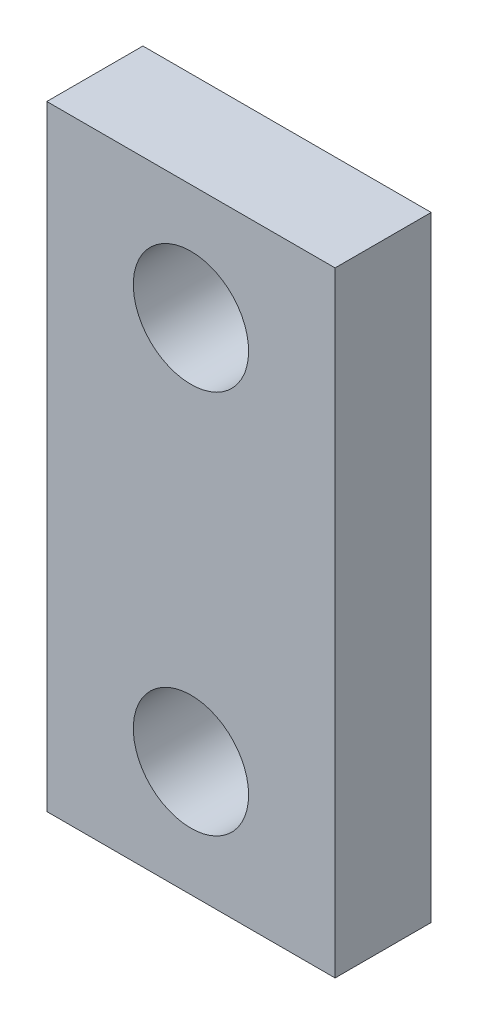
ISO-10303-21;
HEADER;
FILE_DESCRIPTION(('STEP AP214'),'2;1');
FILE_NAME('part.step','',(''),(''),'','','');
FILE_SCHEMA(('AUTOMOTIVE_DESIGN { 1 0 10303 214 1 1 1 1 }'));
ENDSEC;
DATA;
#1=APPLICATION_CONTEXT('core data for automotive mechanical design processes');
#2=APPLICATION_PROTOCOL_DEFINITION('international standard','automotive_design',2000,#1);
#3=PRODUCT_CONTEXT('',#1,'mechanical');
#4=PRODUCT('Part','Part','',(#3));
#5=PRODUCT_RELATED_PRODUCT_CATEGORY('part','',(#4));
#6=PRODUCT_DEFINITION_FORMATION('','',#4);
#7=PRODUCT_DEFINITION_CONTEXT('part definition',#1,'design');
#8=PRODUCT_DEFINITION('design','',#6,#7);
#9=PRODUCT_DEFINITION_SHAPE('','',#8);
#10=(LENGTH_UNIT() NAMED_UNIT(*) SI_UNIT(.MILLI.,.METRE.));
#11=(NAMED_UNIT(*) PLANE_ANGLE_UNIT() SI_UNIT($,.RADIAN.));
#12=(NAMED_UNIT(*) SI_UNIT($,.STERADIAN.) SOLID_ANGLE_UNIT());
#13=UNCERTAINTY_MEASURE_WITH_UNIT(LENGTH_MEASURE(1.E-05),#10,'distance_accuracy_value','');
#14=(GEOMETRIC_REPRESENTATION_CONTEXT(3) GLOBAL_UNCERTAINTY_ASSIGNED_CONTEXT((#13)) GLOBAL_UNIT_ASSIGNED_CONTEXT((#10,
#11,#12)) REPRESENTATION_CONTEXT('',''));
#15=CARTESIAN_POINT('',(0.,0.,0.));
#16=DIRECTION('',(0.,0.,1.));
#17=DIRECTION('',(1.,0.,0.));
#18=AXIS2_PLACEMENT_3D('',#15,#16,#17);
#19=CARTESIAN_POINT('',(0.,0.,5.));
#20=DIRECTION('',(0.,0.,-1.));
#21=DIRECTION('',(-1.,0.,0.));
#22=AXIS2_PLACEMENT_3D('',#19,#20,#21);
#23=PLANE('',#22);
#24=DIRECTION('',(0.,1.,0.));
#25=VECTOR('',#24,1.);
#26=CARTESIAN_POINT('',(7.5,-16.,5.));
#27=LINE('',#26,#25);
#28=CARTESIAN_POINT('',(7.5,-16.,5.));
#29=VERTEX_POINT('',#28);
#30=CARTESIAN_POINT('',(7.5,16.,5.));
#31=VERTEX_POINT('',#30);
#32=EDGE_CURVE('E87',#29,#31,#27,.T.);
#33=ORIENTED_EDGE('',*,*,#32,.T.);
#34=DIRECTION('',(-1.,0.,0.));
#35=VECTOR('',#34,1.);
#36=CARTESIAN_POINT('',(-7.5,16.,5.));
#37=LINE('',#36,#35);
#38=CARTESIAN_POINT('',(-7.5,16.,5.));
#39=VERTEX_POINT('',#38);
#40=EDGE_CURVE('E82',#31,#39,#37,.T.);
#41=ORIENTED_EDGE('',*,*,#40,.T.);
#42=DIRECTION('',(0.,-1.,0.));
#43=VECTOR('',#42,1.);
#44=CARTESIAN_POINT('',(-7.5,-16.,5.));
#45=LINE('',#44,#43);
#46=CARTESIAN_POINT('',(-7.5,-16.,5.));
#47=VERTEX_POINT('',#46);
#48=EDGE_CURVE('E85',#39,#47,#45,.T.);
#49=ORIENTED_EDGE('',*,*,#48,.T.);
#50=DIRECTION('',(1.,0.,0.));
#51=VECTOR('',#50,1.);
#52=CARTESIAN_POINT('',(-7.5,-16.,5.));
#53=LINE('',#52,#51);
#54=EDGE_CURVE('E52',#47,#29,#53,.T.);
#55=ORIENTED_EDGE('',*,*,#54,.T.);
#56=EDGE_LOOP('',(#33,#41,#49,#55));
#57=FACE_BOUND('',#56,.T.);
#58=CARTESIAN_POINT('',(0.,10.,5.));
#59=DIRECTION('',(0.,0.,1.));
#60=DIRECTION('',(1.,0.,0.));
#61=AXIS2_PLACEMENT_3D('',#58,#59,#60);
#62=CIRCLE('',#61,3.);
#63=CARTESIAN_POINT('',(3.,10.,5.));
#64=VERTEX_POINT('',#63);
#65=EDGE_CURVE('E102',#64,#64,#62,.T.);
#66=ORIENTED_EDGE('',*,*,#65,.F.);
#67=EDGE_LOOP('',(#66));
#68=FACE_BOUND('',#67,.T.);
#69=CARTESIAN_POINT('',(0.,-10.,5.));
#70=DIRECTION('',(0.,0.,1.));
#71=DIRECTION('',(1.,0.,0.));
#72=AXIS2_PLACEMENT_3D('',#69,#70,#71);
#73=CIRCLE('',#72,3.);
#74=CARTESIAN_POINT('',(3.,-10.,5.));
#75=VERTEX_POINT('',#74);
#76=EDGE_CURVE('E117',#75,#75,#73,.T.);
#77=ORIENTED_EDGE('',*,*,#76,.F.);
#78=EDGE_LOOP('',(#77));
#79=FACE_BOUND('',#78,.T.);
#80=ADVANCED_FACE('F35',(#57,#68,#79),#23,.F.);
#81=CARTESIAN_POINT('',(0.,0.,0.));
#82=DIRECTION('',(0.,0.,-1.));
#83=DIRECTION('',(-1.,0.,0.));
#84=AXIS2_PLACEMENT_3D('',#81,#82,#83);
#85=PLANE('',#84);
#86=CARTESIAN_POINT('',(0.,10.,0.));
#87=DIRECTION('',(0.,0.,1.));
#88=DIRECTION('',(1.,0.,0.));
#89=AXIS2_PLACEMENT_3D('',#86,#87,#88);
#90=CIRCLE('',#89,3.);
#91=CARTESIAN_POINT('',(3.,10.,0.));
#92=VERTEX_POINT('',#91);
#93=EDGE_CURVE('E114',#92,#92,#90,.T.);
#94=ORIENTED_EDGE('',*,*,#93,.T.);
#95=EDGE_LOOP('',(#94));
#96=FACE_BOUND('',#95,.T.);
#97=DIRECTION('',(0.,1.,0.));
#98=VECTOR('',#97,1.);
#99=CARTESIAN_POINT('',(7.5,-16.,0.));
#100=LINE('',#99,#98);
#101=CARTESIAN_POINT('',(7.5,-16.,0.));
#102=VERTEX_POINT('',#101);
#103=CARTESIAN_POINT('',(7.5,16.,0.));
#104=VERTEX_POINT('',#103);
#105=EDGE_CURVE('E99',#102,#104,#100,.T.);
#106=ORIENTED_EDGE('',*,*,#105,.F.);
#107=DIRECTION('',(1.,0.,0.));
#108=VECTOR('',#107,1.);
#109=CARTESIAN_POINT('',(-7.5,-16.,0.));
#110=LINE('',#109,#108);
#111=CARTESIAN_POINT('',(-7.5,-16.,0.));
#112=VERTEX_POINT('',#111);
#113=EDGE_CURVE('E75',#112,#102,#110,.T.);
#114=ORIENTED_EDGE('',*,*,#113,.F.);
#115=DIRECTION('',(0.,-1.,0.));
#116=VECTOR('',#115,1.);
#117=CARTESIAN_POINT('',(-7.5,-16.,0.));
#118=LINE('',#117,#116);
#119=CARTESIAN_POINT('',(-7.5,16.,0.));
#120=VERTEX_POINT('',#119);
#121=EDGE_CURVE('E69',#120,#112,#118,.T.);
#122=ORIENTED_EDGE('',*,*,#121,.F.);
#123=DIRECTION('',(-1.,0.,0.));
#124=VECTOR('',#123,1.);
#125=CARTESIAN_POINT('',(-7.5,16.,0.));
#126=LINE('',#125,#124);
#127=EDGE_CURVE('E91',#104,#120,#126,.T.);
#128=ORIENTED_EDGE('',*,*,#127,.F.);
#129=EDGE_LOOP('',(#106,#114,#122,#128));
#130=FACE_BOUND('',#129,.T.);
#131=CARTESIAN_POINT('',(0.,-10.,0.));
#132=DIRECTION('',(0.,0.,1.));
#133=DIRECTION('',(1.,0.,0.));
#134=AXIS2_PLACEMENT_3D('',#131,#132,#133);
#135=CIRCLE('',#134,3.);
#136=CARTESIAN_POINT('',(3.,-10.,0.));
#137=VERTEX_POINT('',#136);
#138=EDGE_CURVE('E120',#137,#137,#135,.T.);
#139=ORIENTED_EDGE('',*,*,#138,.T.);
#140=EDGE_LOOP('',(#139));
#141=FACE_BOUND('',#140,.T.);
#142=ADVANCED_FACE('F110',(#96,#130,#141),#85,.T.);
#143=CARTESIAN_POINT('',(7.5,-16.,5.));
#144=DIRECTION('',(-1.,0.,0.));
#145=DIRECTION('',(0.,0.,1.));
#146=AXIS2_PLACEMENT_3D('',#143,#144,#145);
#147=PLANE('',#146);
#148=ORIENTED_EDGE('',*,*,#105,.T.);
#149=DIRECTION('',(0.,0.,-1.));
#150=VECTOR('',#149,1.);
#151=CARTESIAN_POINT('',(7.5,16.,5.));
#152=LINE('',#151,#150);
#153=EDGE_CURVE('E11',#31,#104,#152,.T.);
#154=ORIENTED_EDGE('',*,*,#153,.F.);
#155=ORIENTED_EDGE('',*,*,#32,.F.);
#156=DIRECTION('',(0.,0.,-1.));
#157=VECTOR('',#156,1.);
#158=CARTESIAN_POINT('',(7.5,-16.,5.));
#159=LINE('',#158,#157);
#160=EDGE_CURVE('E95',#29,#102,#159,.T.);
#161=ORIENTED_EDGE('',*,*,#160,.T.);
#162=EDGE_LOOP('',(#148,#154,#155,#161));
#163=FACE_BOUND('',#162,.T.);
#164=ADVANCED_FACE('F37',(#163),#147,.F.);
#165=CARTESIAN_POINT('',(-7.5,16.,5.));
#166=DIRECTION('',(0.,-1.,0.));
#167=DIRECTION('',(0.,0.,-1.));
#168=AXIS2_PLACEMENT_3D('',#165,#166,#167);
#169=PLANE('',#168);
#170=ORIENTED_EDGE('',*,*,#127,.T.);
#171=DIRECTION('',(0.,0.,-1.));
#172=VECTOR('',#171,1.);
#173=CARTESIAN_POINT('',(-7.5,16.,5.));
#174=LINE('',#173,#172);
#175=EDGE_CURVE('E44',#39,#120,#174,.T.);
#176=ORIENTED_EDGE('',*,*,#175,.F.);
#177=ORIENTED_EDGE('',*,*,#40,.F.);
#178=ORIENTED_EDGE('',*,*,#153,.T.);
#179=EDGE_LOOP('',(#170,#176,#177,#178));
#180=FACE_BOUND('',#179,.T.);
#181=ADVANCED_FACE('F90',(#180),#169,.F.);
#182=CARTESIAN_POINT('',(-7.5,-16.,5.));
#183=DIRECTION('',(1.,0.,0.));
#184=DIRECTION('',(0.,0.,-1.));
#185=AXIS2_PLACEMENT_3D('',#182,#183,#184);
#186=PLANE('',#185);
#187=ORIENTED_EDGE('',*,*,#121,.T.);
#188=DIRECTION('',(0.,0.,-1.));
#189=VECTOR('',#188,1.);
#190=CARTESIAN_POINT('',(-7.5,-16.,5.));
#191=LINE('',#190,#189);
#192=EDGE_CURVE('E92',#47,#112,#191,.T.);
#193=ORIENTED_EDGE('',*,*,#192,.F.);
#194=ORIENTED_EDGE('',*,*,#48,.F.);
#195=ORIENTED_EDGE('',*,*,#175,.T.);
#196=EDGE_LOOP('',(#187,#193,#194,#195));
#197=FACE_BOUND('',#196,.T.);
#198=ADVANCED_FACE('F93',(#197),#186,.F.);
#199=CARTESIAN_POINT('',(-7.5,-16.,5.));
#200=DIRECTION('',(0.,1.,0.));
#201=DIRECTION('',(0.,0.,1.));
#202=AXIS2_PLACEMENT_3D('',#199,#200,#201);
#203=PLANE('',#202);
#204=ORIENTED_EDGE('',*,*,#113,.T.);
#205=ORIENTED_EDGE('',*,*,#160,.F.);
#206=ORIENTED_EDGE('',*,*,#54,.F.);
#207=ORIENTED_EDGE('',*,*,#192,.T.);
#208=EDGE_LOOP('',(#204,#205,#206,#207));
#209=FACE_BOUND('',#208,.T.);
#210=ADVANCED_FACE('F107',(#209),#203,.F.);
#211=CARTESIAN_POINT('',(0.,10.,5.));
#212=DIRECTION('',(0.,0.,-1.));
#213=DIRECTION('',(-1.,0.,0.));
#214=AXIS2_PLACEMENT_3D('',#211,#212,#213);
#215=CYLINDRICAL_SURFACE('',#214,3.);
#216=ORIENTED_EDGE('',*,*,#65,.T.);
#217=EDGE_LOOP('',(#216));
#218=FACE_BOUND('',#217,.T.);
#219=ORIENTED_EDGE('',*,*,#93,.F.);
#220=EDGE_LOOP('',(#219));
#221=FACE_BOUND('',#220,.T.);
#222=ADVANCED_FACE('F137',(#218,#221),#215,.F.);
#223=CARTESIAN_POINT('',(0.,-10.,5.));
#224=DIRECTION('',(0.,0.,-1.));
#225=DIRECTION('',(-1.,0.,0.));
#226=AXIS2_PLACEMENT_3D('',#223,#224,#225);
#227=CYLINDRICAL_SURFACE('',#226,3.);
#228=ORIENTED_EDGE('',*,*,#76,.T.);
#229=EDGE_LOOP('',(#228));
#230=FACE_BOUND('',#229,.T.);
#231=ORIENTED_EDGE('',*,*,#138,.F.);
#232=EDGE_LOOP('',(#231));
#233=FACE_BOUND('',#232,.T.);
#234=ADVANCED_FACE('F126',(#230,#233),#227,.F.);
#235=CLOSED_SHELL('',(#80,#142,#164,#181,#198,#210,#222,#234));
#236=MANIFOLD_SOLID_BREP('B2',#235);
#237=ADVANCED_BREP_SHAPE_REPRESENTATION('',(#18,#236),#14);
#238=SHAPE_DEFINITION_REPRESENTATION(#9,#237);
ENDSEC;
END-ISO-10303-21;
